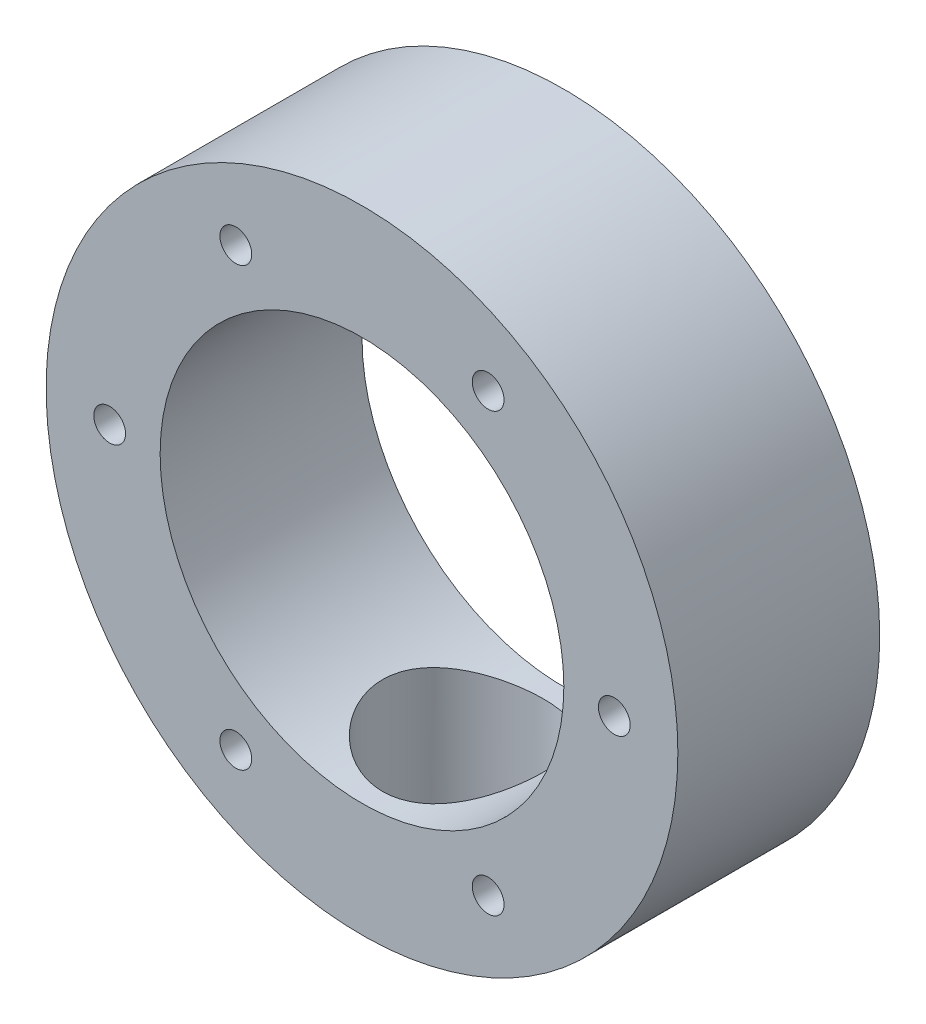
ISO-10303-21;
HEADER;
FILE_DESCRIPTION(('STEP AP214'),'2;1');
FILE_NAME('part.step','',(''),(''),'','','');
FILE_SCHEMA(('AUTOMOTIVE_DESIGN { 1 0 10303 214 1 1 1 1 }'));
ENDSEC;
DATA;
#1=APPLICATION_CONTEXT('core data for automotive mechanical design processes');
#2=APPLICATION_PROTOCOL_DEFINITION('international standard','automotive_design',2000,#1);
#3=PRODUCT_CONTEXT('',#1,'mechanical');
#4=PRODUCT('Part','Part','',(#3));
#5=PRODUCT_RELATED_PRODUCT_CATEGORY('part','',(#4));
#6=PRODUCT_DEFINITION_FORMATION('','',#4);
#7=PRODUCT_DEFINITION_CONTEXT('part definition',#1,'design');
#8=PRODUCT_DEFINITION('design','',#6,#7);
#9=PRODUCT_DEFINITION_SHAPE('','',#8);
#10=(LENGTH_UNIT() NAMED_UNIT(*) SI_UNIT(.MILLI.,.METRE.));
#11=(NAMED_UNIT(*) PLANE_ANGLE_UNIT() SI_UNIT($,.RADIAN.));
#12=(NAMED_UNIT(*) SI_UNIT($,.STERADIAN.) SOLID_ANGLE_UNIT());
#13=UNCERTAINTY_MEASURE_WITH_UNIT(LENGTH_MEASURE(1.E-05),#10,'distance_accuracy_value','');
#14=(GEOMETRIC_REPRESENTATION_CONTEXT(3) GLOBAL_UNCERTAINTY_ASSIGNED_CONTEXT((#13)) GLOBAL_UNIT_ASSIGNED_CONTEXT((#10,
#11,#12)) REPRESENTATION_CONTEXT('',''));
#15=CARTESIAN_POINT('',(0.,0.,0.));
#16=DIRECTION('',(0.,0.,1.));
#17=DIRECTION('',(1.,0.,0.));
#18=AXIS2_PLACEMENT_3D('',#15,#16,#17);
#19=CARTESIAN_POINT('',(0.,0.,6.35));
#20=DIRECTION('',(0.,0.,1.));
#21=DIRECTION('',(1.,0.,0.));
#22=AXIS2_PLACEMENT_3D('',#19,#20,#21);
#23=PLANE('',#22);
#24=CARTESIAN_POINT('',(3.96874999999994,-6.87407664253902,6.35));
#25=DIRECTION('',(0.,0.,1.));
#26=DIRECTION('',(1.,0.,0.));
#27=AXIS2_PLACEMENT_3D('',#24,#25,#26);
#28=CIRCLE('',#27,0.5);
#29=CARTESIAN_POINT('',(4.46874999999994,-6.87407664253902,6.35));
#30=VERTEX_POINT('',#29);
#31=EDGE_CURVE('E80',#30,#30,#28,.T.);
#32=ORIENTED_EDGE('',*,*,#31,.F.);
#33=EDGE_LOOP('',(#32));
#34=FACE_BOUND('',#33,.T.);
#35=CARTESIAN_POINT('',(3.96875000000003,6.87407664253897,6.35));
#36=DIRECTION('',(0.,0.,1.));
#37=DIRECTION('',(1.,0.,0.));
#38=AXIS2_PLACEMENT_3D('',#35,#36,#37);
#39=CIRCLE('',#38,0.500000000000001);
#40=CARTESIAN_POINT('',(4.46875000000004,6.87407664253897,6.35));
#41=VERTEX_POINT('',#40);
#42=EDGE_CURVE('E68',#41,#41,#39,.T.);
#43=ORIENTED_EDGE('',*,*,#42,.F.);
#44=EDGE_LOOP('',(#43));
#45=FACE_BOUND('',#44,.T.);
#46=CARTESIAN_POINT('',(-7.9375,0.,6.35));
#47=DIRECTION('',(0.,0.,1.));
#48=DIRECTION('',(1.,0.,0.));
#49=AXIS2_PLACEMENT_3D('',#46,#47,#48);
#50=CIRCLE('',#49,0.500000000000001);
#51=CARTESIAN_POINT('',(-7.4375,0.,6.35));
#52=VERTEX_POINT('',#51);
#53=EDGE_CURVE('E56',#52,#52,#50,.T.);
#54=ORIENTED_EDGE('',*,*,#53,.F.);
#55=EDGE_LOOP('',(#54));
#56=FACE_BOUND('',#55,.T.);
#57=CARTESIAN_POINT('',(0.,0.,6.35));
#58=DIRECTION('',(0.,0.,1.));
#59=DIRECTION('',(1.,0.,0.));
#60=AXIS2_PLACEMENT_3D('',#57,#58,#59);
#61=CIRCLE('',#60,9.9375);
#62=CARTESIAN_POINT('',(9.9375,0.,6.35));
#63=VERTEX_POINT('',#62);
#64=EDGE_CURVE('E42',#63,#63,#61,.T.);
#65=ORIENTED_EDGE('',*,*,#64,.T.);
#66=EDGE_LOOP('',(#65));
#67=FACE_BOUND('',#66,.T.);
#68=CARTESIAN_POINT('',(0.,0.,6.35));
#69=DIRECTION('',(0.,0.,1.));
#70=DIRECTION('',(1.,0.,0.));
#71=AXIS2_PLACEMENT_3D('',#68,#69,#70);
#72=CIRCLE('',#71,6.35);
#73=CARTESIAN_POINT('',(6.35,0.,6.35));
#74=VERTEX_POINT('',#73);
#75=EDGE_CURVE('E51',#74,#74,#72,.T.);
#76=ORIENTED_EDGE('',*,*,#75,.F.);
#77=EDGE_LOOP('',(#76));
#78=FACE_BOUND('',#77,.T.);
#79=CARTESIAN_POINT('',(-3.96874999999999,6.87407664253899,6.35));
#80=DIRECTION('',(0.,0.,1.));
#81=DIRECTION('',(1.,0.,0.));
#82=AXIS2_PLACEMENT_3D('',#79,#80,#81);
#83=CIRCLE('',#82,0.500000000000001);
#84=CARTESIAN_POINT('',(-3.46874999999999,6.87407664253899,6.35));
#85=VERTEX_POINT('',#84);
#86=EDGE_CURVE('E62',#85,#85,#83,.T.);
#87=ORIENTED_EDGE('',*,*,#86,.F.);
#88=EDGE_LOOP('',(#87));
#89=FACE_BOUND('',#88,.T.);
#90=CARTESIAN_POINT('',(7.9375,0.,6.35));
#91=DIRECTION('',(0.,0.,1.));
#92=DIRECTION('',(1.,0.,0.));
#93=AXIS2_PLACEMENT_3D('',#90,#91,#92);
#94=CIRCLE('',#93,0.500000000000001);
#95=CARTESIAN_POINT('',(8.4375,0.,6.35));
#96=VERTEX_POINT('',#95);
#97=EDGE_CURVE('E74',#96,#96,#94,.T.);
#98=ORIENTED_EDGE('',*,*,#97,.F.);
#99=EDGE_LOOP('',(#98));
#100=FACE_BOUND('',#99,.T.);
#101=CARTESIAN_POINT('',(-3.96875000000008,-6.87407664253894,6.35));
#102=DIRECTION('',(0.,0.,1.));
#103=DIRECTION('',(1.,0.,0.));
#104=AXIS2_PLACEMENT_3D('',#101,#102,#103);
#105=CIRCLE('',#104,0.500000000000001);
#106=CARTESIAN_POINT('',(-3.46875000000008,-6.87407664253894,6.35));
#107=VERTEX_POINT('',#106);
#108=EDGE_CURVE('E86',#107,#107,#105,.T.);
#109=ORIENTED_EDGE('',*,*,#108,.F.);
#110=EDGE_LOOP('',(#109));
#111=FACE_BOUND('',#110,.T.);
#112=ADVANCED_FACE('F31',(#34,#45,#56,#67,#78,#89,#100,#111),#23,.T.);
#113=CARTESIAN_POINT('',(0.,0.,0.));
#114=DIRECTION('',(0.,0.,1.));
#115=DIRECTION('',(1.,0.,0.));
#116=AXIS2_PLACEMENT_3D('',#113,#114,#115);
#117=PLANE('',#116);
#118=CARTESIAN_POINT('',(3.96874999999994,-6.87407664253902,0.));
#119=DIRECTION('',(0.,0.,1.));
#120=DIRECTION('',(1.,0.,0.));
#121=AXIS2_PLACEMENT_3D('',#118,#119,#120);
#122=CIRCLE('',#121,0.5);
#123=CARTESIAN_POINT('',(4.46874999999994,-6.87407664253902,0.));
#124=VERTEX_POINT('',#123);
#125=EDGE_CURVE('E83',#124,#124,#122,.T.);
#126=ORIENTED_EDGE('',*,*,#125,.T.);
#127=EDGE_LOOP('',(#126));
#128=FACE_BOUND('',#127,.T.);
#129=CARTESIAN_POINT('',(3.96875000000003,6.87407664253897,0.));
#130=DIRECTION('',(0.,0.,1.));
#131=DIRECTION('',(1.,0.,0.));
#132=AXIS2_PLACEMENT_3D('',#129,#130,#131);
#133=CIRCLE('',#132,0.500000000000001);
#134=CARTESIAN_POINT('',(4.46875000000004,6.87407664253897,0.));
#135=VERTEX_POINT('',#134);
#136=EDGE_CURVE('E71',#135,#135,#133,.T.);
#137=ORIENTED_EDGE('',*,*,#136,.T.);
#138=EDGE_LOOP('',(#137));
#139=FACE_BOUND('',#138,.T.);
#140=CARTESIAN_POINT('',(-7.9375,0.,0.));
#141=DIRECTION('',(0.,0.,1.));
#142=DIRECTION('',(1.,0.,0.));
#143=AXIS2_PLACEMENT_3D('',#140,#141,#142);
#144=CIRCLE('',#143,0.500000000000001);
#145=CARTESIAN_POINT('',(-7.4375,0.,0.));
#146=VERTEX_POINT('',#145);
#147=EDGE_CURVE('E59',#146,#146,#144,.T.);
#148=ORIENTED_EDGE('',*,*,#147,.T.);
#149=EDGE_LOOP('',(#148));
#150=FACE_BOUND('',#149,.T.);
#151=CARTESIAN_POINT('',(0.,0.,0.));
#152=DIRECTION('',(0.,0.,1.));
#153=DIRECTION('',(1.,0.,0.));
#154=AXIS2_PLACEMENT_3D('',#151,#152,#153);
#155=CIRCLE('',#154,9.9375);
#156=CARTESIAN_POINT('',(9.9375,0.,0.));
#157=VERTEX_POINT('',#156);
#158=EDGE_CURVE('E46',#157,#157,#155,.T.);
#159=ORIENTED_EDGE('',*,*,#158,.F.);
#160=EDGE_LOOP('',(#159));
#161=FACE_BOUND('',#160,.T.);
#162=CARTESIAN_POINT('',(0.,0.,0.));
#163=DIRECTION('',(0.,0.,1.));
#164=DIRECTION('',(1.,0.,0.));
#165=AXIS2_PLACEMENT_3D('',#162,#163,#164);
#166=CIRCLE('',#165,6.35);
#167=CARTESIAN_POINT('',(6.35,0.,0.));
#168=VERTEX_POINT('',#167);
#169=EDGE_CURVE('E53',#168,#168,#166,.T.);
#170=ORIENTED_EDGE('',*,*,#169,.T.);
#171=EDGE_LOOP('',(#170));
#172=FACE_BOUND('',#171,.T.);
#173=CARTESIAN_POINT('',(-3.96874999999999,6.87407664253899,0.));
#174=DIRECTION('',(0.,0.,1.));
#175=DIRECTION('',(1.,0.,0.));
#176=AXIS2_PLACEMENT_3D('',#173,#174,#175);
#177=CIRCLE('',#176,0.500000000000001);
#178=CARTESIAN_POINT('',(-3.46874999999999,6.87407664253899,0.));
#179=VERTEX_POINT('',#178);
#180=EDGE_CURVE('E65',#179,#179,#177,.T.);
#181=ORIENTED_EDGE('',*,*,#180,.T.);
#182=EDGE_LOOP('',(#181));
#183=FACE_BOUND('',#182,.T.);
#184=CARTESIAN_POINT('',(7.9375,0.,0.));
#185=DIRECTION('',(0.,0.,1.));
#186=DIRECTION('',(1.,0.,0.));
#187=AXIS2_PLACEMENT_3D('',#184,#185,#186);
#188=CIRCLE('',#187,0.500000000000001);
#189=CARTESIAN_POINT('',(8.4375,0.,0.));
#190=VERTEX_POINT('',#189);
#191=EDGE_CURVE('E77',#190,#190,#188,.T.);
#192=ORIENTED_EDGE('',*,*,#191,.T.);
#193=EDGE_LOOP('',(#192));
#194=FACE_BOUND('',#193,.T.);
#195=CARTESIAN_POINT('',(-3.96875000000008,-6.87407664253894,0.));
#196=DIRECTION('',(0.,0.,1.));
#197=DIRECTION('',(1.,0.,0.));
#198=AXIS2_PLACEMENT_3D('',#195,#196,#197);
#199=CIRCLE('',#198,0.500000000000001);
#200=CARTESIAN_POINT('',(-3.46875000000008,-6.87407664253894,0.));
#201=VERTEX_POINT('',#200);
#202=EDGE_CURVE('E89',#201,#201,#199,.T.);
#203=ORIENTED_EDGE('',*,*,#202,.T.);
#204=EDGE_LOOP('',(#203));
#205=FACE_BOUND('',#204,.T.);
#206=ADVANCED_FACE('F137',(#128,#139,#150,#161,#172,#183,#194,#205),#117,.F.);
#207=CARTESIAN_POINT('',(0.,0.,6.35));
#208=DIRECTION('',(0.,0.,-1.));
#209=DIRECTION('',(-1.,0.,0.));
#210=AXIS2_PLACEMENT_3D('',#207,#208,#209);
#211=CYLINDRICAL_SURFACE('',#210,9.9375);
#212=CARTESIAN_POINT('',(0.,-9.9375,0.647700000000002));
#213=CARTESIAN_POINT('',(-0.139556053405079,-9.93749769600198,0.647703771148036));
#214=CARTESIAN_POINT('',(-0.279153777595829,-9.93453104426548,0.659298161836035));
#215=CARTESIAN_POINT('',(-0.55434313250879,-9.92298410593462,0.705296731122764));
#216=CARTESIAN_POINT('',(-0.689932537682376,-9.91440075976008,0.739713341798802));
#217=CARTESIAN_POINT('',(-0.953091975487984,-9.89257012044472,0.83017665550556));
#218=CARTESIAN_POINT('',(-1.08067159825626,-9.87932853516018,0.886196895119666));
#219=CARTESIAN_POINT('',(-1.32462297022286,-9.84958889691357,1.01818287824129));
#220=CARTESIAN_POINT('',(-1.44099424608338,-9.83309070651201,1.09414946359518));
#221=CARTESIAN_POINT('',(-1.66169914730052,-9.7982343573015,1.26557713606802));
#222=CARTESIAN_POINT('',(-1.76576058990921,-9.77984670596307,1.36138266373195));
#223=CARTESIAN_POINT('',(-1.95652551628507,-9.74347809165346,1.56903149813308));
#224=CARTESIAN_POINT('',(-2.04322697287238,-9.72549717639534,1.68087667525621));
#225=CARTESIAN_POINT('',(-2.19810276870784,-9.69167947598302,1.91955831233387));
#226=CARTESIAN_POINT('',(-2.26597044492766,-9.67588007449177,2.04659953929622));
#227=CARTESIAN_POINT('',(-2.37927927609972,-9.64864527685565,2.31075493471741));
#228=CARTESIAN_POINT('',(-2.42472415429458,-9.63720915627179,2.44786742652417));
#229=CARTESIAN_POINT('',(-2.49096458934665,-9.62029922883659,2.72527478584326));
#230=CARTESIAN_POINT('',(-2.5122505865218,-9.61470698141808,2.8654451544209));
#231=CARTESIAN_POINT('',(-2.53109702988809,-9.60976361772754,3.14747031259233));
#232=CARTESIAN_POINT('',(-2.52866147958537,-9.61041144831191,3.28932481391743));
#233=CARTESIAN_POINT('',(-2.50052477205014,-9.61776869141806,3.56691531926991));
#234=CARTESIAN_POINT('',(-2.4754102969208,-9.62432524237752,3.70271547683842));
#235=CARTESIAN_POINT('',(-2.4035654865923,-9.6425172685715,3.96810868425311));
#236=CARTESIAN_POINT('',(-2.35683356373631,-9.65415311684286,4.09770127742365));
#237=CARTESIAN_POINT('',(-2.24258602569987,-9.68133147566003,4.34856270866521));
#238=CARTESIAN_POINT('',(-2.17485933286276,-9.69691335359014,4.4697309730815));
#239=CARTESIAN_POINT('',(-2.02069229302991,-9.73020613321525,4.69919217540447));
#240=CARTESIAN_POINT('',(-1.93424856673079,-9.74791741911124,4.80748278281259));
#241=CARTESIAN_POINT('',(-1.74207226023853,-9.78411516928911,5.01147423061153));
#242=CARTESIAN_POINT('',(-1.63584519843488,-9.80260907495806,5.10670851207337));
#243=CARTESIAN_POINT('',(-1.40870538393845,-9.83781700884755,5.27810163356944));
#244=CARTESIAN_POINT('',(-1.28779215152916,-9.85453097889388,5.35425985024448));
#245=CARTESIAN_POINT('',(-1.03403221039178,-9.88438380114255,5.48551887750673));
#246=CARTESIAN_POINT('',(-0.901143505662362,-9.89750936487115,5.54054171677394));
#247=CARTESIAN_POINT('',(-0.627593850871005,-9.91861001075401,5.62733574727157));
#248=CARTESIAN_POINT('',(-0.486934446868745,-9.92658611346819,5.65911154594631));
#249=CARTESIAN_POINT('',(-0.205823341034537,-9.93633727966082,5.69779189917353));
#250=CARTESIAN_POINT('',(-0.0654643884619986,-9.93827065048098,5.7053315458635));
#251=CARTESIAN_POINT('',(0.214510413137534,-9.93617048086652,5.69707050100478));
#252=CARTESIAN_POINT('',(0.354126330326764,-9.93213749756472,5.68127198875264));
#253=CARTESIAN_POINT('',(0.626429803530197,-9.91865942843353,5.62730596074036));
#254=CARTESIAN_POINT('',(0.759190969100928,-9.90929869624874,5.58948688414094));
#255=CARTESIAN_POINT('',(1.01647634558523,-9.88622177161489,5.49295294629532));
#256=CARTESIAN_POINT('',(1.14099970666764,-9.87250513064412,5.43423593314314));
#257=CARTESIAN_POINT('',(1.3807865899656,-9.84186080343859,5.29635550170162));
#258=CARTESIAN_POINT('',(1.49583999613298,-9.82487915288253,5.21683895724093));
#259=CARTESIAN_POINT('',(1.71119507994737,-9.78967032018159,5.04006610727776));
#260=CARTESIAN_POINT('',(1.81149411248579,-9.77144291555839,4.94280662787289));
#261=CARTESIAN_POINT('',(1.99712561406245,-9.73522382550345,4.73035591550872));
#262=CARTESIAN_POINT('',(2.08201188410304,-9.71724996454226,4.61477109735536));
#263=CARTESIAN_POINT('',(2.23118540556649,-9.68408901372488,4.37062456567735));
#264=CARTESIAN_POINT('',(2.29547356247125,-9.66890180138168,4.2420634229117));
#265=CARTESIAN_POINT('',(2.40114462600812,-9.64320327445182,3.97629402397275));
#266=CARTESIAN_POINT('',(2.44266294745312,-9.63266439078201,3.83914241575637));
#267=CARTESIAN_POINT('',(2.50196447261635,-9.61743391204497,3.55949519622106));
#268=CARTESIAN_POINT('',(2.51975308447373,-9.61274098466636,3.41700081016604));
#269=CARTESIAN_POINT('',(2.53080029489285,-9.60983781966126,3.13526028880717));
#270=CARTESIAN_POINT('',(2.52477303010935,-9.61143884573801,2.99604365961792));
#271=CARTESIAN_POINT('',(2.48999960773946,-9.62050542573587,2.72068187323168));
#272=CARTESIAN_POINT('',(2.4612539379392,-9.62797085374258,2.58453665015318));
#273=CARTESIAN_POINT('',(2.38225595220952,-9.64781803397517,2.31998979127892));
#274=CARTESIAN_POINT('',(2.33214199041156,-9.66016812267134,2.1915443008899));
#275=CARTESIAN_POINT('',(2.21193878730668,-9.68839655016138,1.94479107963602));
#276=CARTESIAN_POINT('',(2.14184668077045,-9.70427539497102,1.82648480608711));
#277=CARTESIAN_POINT('',(1.98145692476559,-9.73830663836046,1.59992799376736));
#278=CARTESIAN_POINT('',(1.89066581615039,-9.75650876151108,1.4920342109975));
#279=CARTESIAN_POINT('',(1.69241105187597,-9.7928437891191,1.29278117674104));
#280=CARTESIAN_POINT('',(1.58494342085758,-9.81097667601314,1.20142587898781));
#281=CARTESIAN_POINT('',(1.35393184888302,-9.84553983376073,1.0361538663315));
#282=CARTESIAN_POINT('',(1.23012218109736,-9.861931393621,0.962599848693917));
#283=CARTESIAN_POINT('',(0.971487354372456,-9.8907529946499,0.837466454148011));
#284=CARTESIAN_POINT('',(0.836669960894002,-9.90318579872014,0.785871742858682));
#285=CARTESIAN_POINT('',(0.585130585367522,-9.92090891347578,0.71354651754425));
#286=CARTESIAN_POINT('',(0.469579154288179,-9.92708718368781,0.68890843574759));
#287=CARTESIAN_POINT('',(0.236028285341764,-9.93538353729363,0.655984242571697));
#288=CARTESIAN_POINT('',(0.118029045960046,-9.9375019485983,0.64769681056469));
#289=CARTESIAN_POINT('',(0.,-9.9375,0.647700000000002));
#290=B_SPLINE_CURVE_WITH_KNOTS('',3,(#212,#213,#214,#215,#216,#217,#218,#219,#220,#221,#222,
#223,#224,#225,#226,#227,#228,#229,#230,#231,#232,#233,#234,#235,#236,#237,#238,#239,#240,#241,
#242,#243,#244,#245,#246,#247,#248,#249,#250,#251,#252,#253,#254,#255,#256,#257,#258,#259,#260,
#261,#262,#263,#264,#265,#266,#267,#268,#269,#270,#271,#272,#273,#274,#275,#276,#277,#278,#279,
#280,#281,#282,#283,#284,#285,#286,#287,#288,#289),.UNSPECIFIED.,.T.,.F.,(4,2,2,2,2,2,2,2,2,2,2,
2,2,2,2,2,2,2,2,2,2,2,2,2,2,2,2,2,2,2,2,2,2,2,2,2,2,2,4),(0.,0.418235549333107,
0.836699113849954,1.25465170035663,1.67262192961583,2.09857057744952,2.52456893566769,
2.95714340797709,3.38964602831797,3.81320207417785,4.23668663735535,4.64952035466162,
5.06238439665581,5.47954184501896,5.89677467278459,6.32633610847186,6.75591157934678,
7.18705693195709,7.61811681060138,8.03778485510959,8.45741371386578,8.87057643755022,
9.28378171781376,9.70451751376344,10.1253286459587,10.5568564656929,10.9883653130938,
11.4172793036744,11.8460955255459,12.262152404137,12.6782003498271,13.0915944487869,
13.5050478658373,13.9296395196232,14.3543325437424,14.7870619214364,15.219488622543,
15.5732384545132,15.9269597132469),.UNSPECIFIED.);
#291=CARTESIAN_POINT('',(0.,-9.9375,0.647700000000002));
#292=VERTEX_POINT('',#291);
#293=EDGE_CURVE('E10',#292,#292,#290,.T.);
#294=ORIENTED_EDGE('',*,*,#293,.T.);
#295=EDGE_LOOP('',(#294));
#296=FACE_BOUND('',#295,.T.);
#297=ORIENTED_EDGE('',*,*,#64,.F.);
#298=EDGE_LOOP('',(#297));
#299=FACE_BOUND('',#298,.T.);
#300=ORIENTED_EDGE('',*,*,#158,.T.);
#301=EDGE_LOOP('',(#300));
#302=FACE_BOUND('',#301,.T.);
#303=ADVANCED_FACE('F33',(#296,#299,#302),#211,.T.);
#304=CARTESIAN_POINT('',(0.,0.,6.35));
#305=DIRECTION('',(0.,0.,-1.));
#306=DIRECTION('',(-1.,0.,0.));
#307=AXIS2_PLACEMENT_3D('',#304,#305,#306);
#308=CYLINDRICAL_SURFACE('',#307,6.35);
#309=CARTESIAN_POINT('',(0.,-6.35,0.647700000000002));
#310=CARTESIAN_POINT('',(-0.135895095575363,-6.34999344928819,0.647708846632159));
#311=CARTESIAN_POINT('',(-0.272014949718178,-6.3455875728316,0.658724038831349));
#312=CARTESIAN_POINT('',(-0.54042737363337,-6.32839909095676,0.702396425438542));
#313=CARTESIAN_POINT('',(-0.672708459361932,-6.31559361140488,0.735112719895103));
#314=CARTESIAN_POINT('',(-0.929120124849737,-6.28298350582966,0.820815253355819));
#315=CARTESIAN_POINT('',(-1.05327574524848,-6.26320171247655,0.87373541353819));
#316=CARTESIAN_POINT('',(-1.29083517107231,-6.2185907868826,0.998081342990934));
#317=CARTESIAN_POINT('',(-1.40424274602626,-6.19376343388583,1.06950059125454));
#318=CARTESIAN_POINT('',(-1.6225478910059,-6.14027730058727,1.23234529630995));
#319=CARTESIAN_POINT('',(-1.72687742035825,-6.11150038485499,1.32449318423862));
#320=CARTESIAN_POINT('',(-1.91908151579658,-6.05390069588419,1.52465483272866));
#321=CARTESIAN_POINT('',(-2.0069481014253,-6.0250779072007,1.63267624298661));
#322=CARTESIAN_POINT('',(-2.16753476663613,-5.96924189122289,1.8672868398416));
#323=CARTESIAN_POINT('',(-2.23941916184942,-5.94236391999891,1.99448353371113));
#324=CARTESIAN_POINT('',(-2.36051973754433,-5.89531161631322,2.26039276958263));
#325=CARTESIAN_POINT('',(-2.40974657700556,-5.87513413293297,2.39909986033074));
#326=CARTESIAN_POINT('',(-2.48184322321096,-5.84503441938308,2.67756800845676));
#327=CARTESIAN_POINT('',(-2.50579965325002,-5.83469146939869,2.81700060655598));
#328=CARTESIAN_POINT('',(-2.53007003568973,-5.8242114145883,3.0982607861768));
#329=CARTESIAN_POINT('',(-2.53039545511286,-5.82406935974612,3.24008717268465));
#330=CARTESIAN_POINT('',(-2.50821868571532,-5.83364792170155,3.51170874378807));
#331=CARTESIAN_POINT('',(-2.48728499266679,-5.84269087655421,3.64166051365505));
#332=CARTESIAN_POINT('',(-2.42579768269568,-5.86848407165412,3.89602622425995));
#333=CARTESIAN_POINT('',(-2.38524067993949,-5.88523564193235,4.0204392052806));
#334=CARTESIAN_POINT('',(-2.28488875878976,-5.92492487572003,4.26317903049335));
#335=CARTESIAN_POINT('',(-2.22472007811308,-5.94798119678154,4.38133109111957));
#336=CARTESIAN_POINT('',(-2.08711501498513,-5.99764888800169,4.60629270694667));
#337=CARTESIAN_POINT('',(-2.00967218801685,-6.02426158345811,4.71309800696674));
#338=CARTESIAN_POINT('',(-1.83275590515023,-6.08052220381734,4.92092812913053));
#339=CARTESIAN_POINT('',(-1.73205069134421,-6.11024661728899,5.02088649783303));
#340=CARTESIAN_POINT('',(-1.51498780315104,-6.16764982352103,5.20283550770597));
#341=CARTESIAN_POINT('',(-1.39862708019575,-6.19532821623303,5.28482264117531));
#342=CARTESIAN_POINT('',(-1.15055639955816,-6.2462017768141,5.42988260071449));
#343=CARTESIAN_POINT('',(-1.01859263895552,-6.2692996447215,5.49255799691528));
#344=CARTESIAN_POINT('',(-0.744842522405649,-6.30767520940892,5.5944534679058));
#345=CARTESIAN_POINT('',(-0.603061144788146,-6.32295683716184,5.63368533467771));
#346=CARTESIAN_POINT('',(-0.322642563022664,-6.3432637460665,5.68543204829192));
#347=CARTESIAN_POINT('',(-0.184309519190646,-6.34883853721909,5.69938031221839));
#348=CARTESIAN_POINT('',(0.0928193417894908,-6.35083191347756,5.70439161709373));
#349=CARTESIAN_POINT('',(0.231615031369769,-6.34725284275709,5.69546051712083));
#350=CARTESIAN_POINT('',(0.499256988182406,-6.331700604547,5.65602362115969));
#351=CARTESIAN_POINT('',(0.62827142477857,-6.32010707578518,5.62649305332527));
#352=CARTESIAN_POINT('',(0.87939741594319,-6.29008462266228,5.54801892496921));
#353=CARTESIAN_POINT('',(1.00150808007104,-6.27165481887362,5.49907286675667));
#354=CARTESIAN_POINT('',(1.23955095948023,-6.22905189187513,5.38156194052759));
#355=CARTESIAN_POINT('',(1.35518098202847,-6.20472068867507,5.31244403976831));
#356=CARTESIAN_POINT('',(1.57360636827681,-6.15295727578712,5.15716587238911));
#357=CARTESIAN_POINT('',(1.6763965909997,-6.12552383230409,5.07099881484527));
#358=CARTESIAN_POINT('',(1.87327223967056,-6.06832273189539,4.87746031543495));
#359=CARTESIAN_POINT('',(1.96634934037784,-6.03851971962499,4.76907093470253));
#360=CARTESIAN_POINT('',(2.13323730306176,-5.98160462933261,4.53767905696105));
#361=CARTESIAN_POINT('',(2.20704512078537,-5.95449297692329,4.41467425539952));
#362=CARTESIAN_POINT('',(2.33373090662017,-5.90600253902098,4.1557616747282));
#363=CARTESIAN_POINT('',(2.38641032900777,-5.88467871906066,4.01974572157379));
#364=CARTESIAN_POINT('',(2.46771450632583,-5.85105611210903,3.73967021834022));
#365=CARTESIAN_POINT('',(2.49635677411131,-5.83875075532614,3.5956166060458));
#366=CARTESIAN_POINT('',(2.52710941809545,-5.82550189193329,3.31463023397183));
#367=CARTESIAN_POINT('',(2.53096703144596,-5.8238103619624,3.17792275236991));
#368=CARTESIAN_POINT('',(2.51661994352938,-5.83002444594917,2.90590645343382));
#369=CARTESIAN_POINT('',(2.49841798152607,-5.8379288683227,2.77059746454482));
#370=CARTESIAN_POINT('',(2.44189016194609,-5.8617873258111,2.51058876905659));
#371=CARTESIAN_POINT('',(2.4043716441077,-5.87741748602149,2.38568112650177));
#372=CARTESIAN_POINT('',(2.31102740821016,-5.91474142468962,2.14388130426449));
#373=CARTESIAN_POINT('',(2.25519664549909,-5.93643687376794,2.02699134403167));
#374=CARTESIAN_POINT('',(2.12314068183601,-5.98497980335223,1.79730137917416));
#375=CARTESIAN_POINT('',(2.04593590880217,-6.01205017140779,1.68511239689961));
#376=CARTESIAN_POINT('',(1.8747657620603,-6.06760621465675,1.47473406823582));
#377=CARTESIAN_POINT('',(1.78079542891168,-6.09609230683346,1.37654887983254));
#378=CARTESIAN_POINT('',(1.57159773472696,-6.15345877453749,1.19052707652271));
#379=CARTESIAN_POINT('',(1.45539560838752,-6.18224798027435,1.10375299743602));
#380=CARTESIAN_POINT('',(1.20902415779901,-6.23511354774023,0.950918320980564));
#381=CARTESIAN_POINT('',(1.07884835418727,-6.25918770844038,0.884867388759695));
#382=CARTESIAN_POINT('',(0.810467300874366,-6.29949438827744,0.776905104562776));
#383=CARTESIAN_POINT('',(0.672459358145955,-6.31586600609259,0.734562697216571));
#384=CARTESIAN_POINT('',(0.461361980768655,-6.33361441723012,0.689122405064101));
#385=CARTESIAN_POINT('',(0.390380978558071,-6.33839446964168,0.676990674930914));
#386=CARTESIAN_POINT('',(0.247536093123044,-6.34557422500662,0.658825144748604));
#387=CARTESIAN_POINT('',(0.175672879895211,-6.34797563337106,0.652786975754108));
#388=CARTESIAN_POINT('',(0.0691545801110535,-6.34971840089543,0.648408350686297));
#389=CARTESIAN_POINT('',(0.0345845685811947,-6.35000166712081,0.647697748579851));
#390=CARTESIAN_POINT('',(0.,-6.35,0.647700000000002));
#391=B_SPLINE_CURVE_WITH_KNOTS('',3,(#309,#310,#311,#312,#313,#314,#315,#316,#317,#318,#319,
#320,#321,#322,#323,#324,#325,#326,#327,#328,#329,#330,#331,#332,#333,#334,#335,#336,#337,#338,
#339,#340,#341,#342,#343,#344,#345,#346,#347,#348,#349,#350,#351,#352,#353,#354,#355,#356,#357,
#358,#359,#360,#361,#362,#363,#364,#365,#366,#367,#368,#369,#370,#371,#372,#373,#374,#375,#376,
#377,#378,#379,#380,#381,#382,#383,#384,#385,#386,#387,#388,#389,#390),.UNSPECIFIED.,.T.,.F.,(4,
2,2,2,2,2,2,2,2,2,2,2,2,2,2,2,2,2,2,2,2,2,2,2,2,2,2,2,2,2,2,2,2,2,2,2,2,2,2,2,4),(0.,
0.407570227143629,0.816254999632602,1.22361442111736,1.63083044164303,2.05538729676068,
2.48014942750687,2.92358490757317,3.36681156489702,3.7900881474376,4.21315933230749,
4.60713256620772,5.00117380106071,5.40321285737543,5.8054021552072,6.23834430653801,
6.67137088623658,7.11279104016825,7.55398897458855,7.96928242713176,8.38446953958645,
8.78122781561114,9.17803714886213,9.58695372627196,9.99603351010808,10.4318556837173,
10.8677466689789,11.3076428447138,11.7472182444353,12.1554299513644,12.5635909735018,
12.9559318250266,13.3483808494001,13.7631570588593,14.1780561678173,14.6194736938952,
15.061096789393,15.4944056174341,15.7106711848639,15.9267815843799,16.0305060080805),.UNSPECIFIED.);
#392=CARTESIAN_POINT('',(0.,-6.35,0.647700000000002));
#393=VERTEX_POINT('',#392);
#394=EDGE_CURVE('E92',#393,#393,#391,.T.);
#395=ORIENTED_EDGE('',*,*,#394,.F.);
#396=EDGE_LOOP('',(#395));
#397=FACE_BOUND('',#396,.T.);
#398=ORIENTED_EDGE('',*,*,#75,.T.);
#399=EDGE_LOOP('',(#398));
#400=FACE_BOUND('',#399,.T.);
#401=ORIENTED_EDGE('',*,*,#169,.F.);
#402=EDGE_LOOP('',(#401));
#403=FACE_BOUND('',#402,.T.);
#404=ADVANCED_FACE('F99',(#397,#400,#403),#308,.F.);
#405=CARTESIAN_POINT('',(-7.9375,0.,6.35));
#406=DIRECTION('',(0.,0.,-1.));
#407=DIRECTION('',(-1.,0.,0.));
#408=AXIS2_PLACEMENT_3D('',#405,#406,#407);
#409=CYLINDRICAL_SURFACE('',#408,0.500000000000001);
#410=ORIENTED_EDGE('',*,*,#53,.T.);
#411=EDGE_LOOP('',(#410));
#412=FACE_BOUND('',#411,.T.);
#413=ORIENTED_EDGE('',*,*,#147,.F.);
#414=EDGE_LOOP('',(#413));
#415=FACE_BOUND('',#414,.T.);
#416=ADVANCED_FACE('F127',(#412,#415),#409,.F.);
#417=CARTESIAN_POINT('',(-3.96874999999999,6.87407664253899,6.35));
#418=DIRECTION('',(0.,0.,-1.));
#419=DIRECTION('',(-1.,0.,0.));
#420=AXIS2_PLACEMENT_3D('',#417,#418,#419);
#421=CYLINDRICAL_SURFACE('',#420,0.500000000000001);
#422=ORIENTED_EDGE('',*,*,#86,.T.);
#423=EDGE_LOOP('',(#422));
#424=FACE_BOUND('',#423,.T.);
#425=ORIENTED_EDGE('',*,*,#180,.F.);
#426=EDGE_LOOP('',(#425));
#427=FACE_BOUND('',#426,.T.);
#428=ADVANCED_FACE('F124',(#424,#427),#421,.F.);
#429=CARTESIAN_POINT('',(3.96875000000003,6.87407664253897,6.35));
#430=DIRECTION('',(0.,0.,-1.));
#431=DIRECTION('',(-1.,0.,0.));
#432=AXIS2_PLACEMENT_3D('',#429,#430,#431);
#433=CYLINDRICAL_SURFACE('',#432,0.500000000000001);
#434=ORIENTED_EDGE('',*,*,#42,.T.);
#435=EDGE_LOOP('',(#434));
#436=FACE_BOUND('',#435,.T.);
#437=ORIENTED_EDGE('',*,*,#136,.F.);
#438=EDGE_LOOP('',(#437));
#439=FACE_BOUND('',#438,.T.);
#440=ADVANCED_FACE('F120',(#436,#439),#433,.F.);
#441=CARTESIAN_POINT('',(7.9375,0.,6.35));
#442=DIRECTION('',(0.,0.,-1.));
#443=DIRECTION('',(-1.,0.,0.));
#444=AXIS2_PLACEMENT_3D('',#441,#442,#443);
#445=CYLINDRICAL_SURFACE('',#444,0.500000000000001);
#446=ORIENTED_EDGE('',*,*,#97,.T.);
#447=EDGE_LOOP('',(#446));
#448=FACE_BOUND('',#447,.T.);
#449=ORIENTED_EDGE('',*,*,#191,.F.);
#450=EDGE_LOOP('',(#449));
#451=FACE_BOUND('',#450,.T.);
#452=ADVANCED_FACE('F116',(#448,#451),#445,.F.);
#453=CARTESIAN_POINT('',(3.96874999999994,-6.87407664253902,6.35));
#454=DIRECTION('',(0.,0.,-1.));
#455=DIRECTION('',(-1.,0.,0.));
#456=AXIS2_PLACEMENT_3D('',#453,#454,#455);
#457=CYLINDRICAL_SURFACE('',#456,0.5);
#458=ORIENTED_EDGE('',*,*,#31,.T.);
#459=EDGE_LOOP('',(#458));
#460=FACE_BOUND('',#459,.T.);
#461=ORIENTED_EDGE('',*,*,#125,.F.);
#462=EDGE_LOOP('',(#461));
#463=FACE_BOUND('',#462,.T.);
#464=ADVANCED_FACE('F112',(#460,#463),#457,.F.);
#465=CARTESIAN_POINT('',(-3.96875000000008,-6.87407664253894,6.35));
#466=DIRECTION('',(0.,0.,-1.));
#467=DIRECTION('',(-1.,0.,0.));
#468=AXIS2_PLACEMENT_3D('',#465,#466,#467);
#469=CYLINDRICAL_SURFACE('',#468,0.500000000000001);
#470=ORIENTED_EDGE('',*,*,#108,.T.);
#471=EDGE_LOOP('',(#470));
#472=FACE_BOUND('',#471,.T.);
#473=ORIENTED_EDGE('',*,*,#202,.F.);
#474=EDGE_LOOP('',(#473));
#475=FACE_BOUND('',#474,.T.);
#476=ADVANCED_FACE('F107',(#472,#475),#469,.F.);
#477=CARTESIAN_POINT('',(0.,-9.9375,3.175));
#478=DIRECTION('',(0.,-1.,0.));
#479=DIRECTION('',(0.,0.,-1.));
#480=AXIS2_PLACEMENT_3D('',#477,#478,#479);
#481=CYLINDRICAL_SURFACE('',#480,2.5273);
#482=ORIENTED_EDGE('',*,*,#394,.T.);
#483=EDGE_LOOP('',(#482));
#484=FACE_BOUND('',#483,.T.);
#485=ORIENTED_EDGE('',*,*,#293,.F.);
#486=EDGE_LOOP('',(#485));
#487=FACE_BOUND('',#486,.T.);
#488=ADVANCED_FACE('F103',(#484,#487),#481,.F.);
#489=CLOSED_SHELL('',(#112,#206,#303,#404,#416,#428,#440,#452,#464,#476,#488));
#490=MANIFOLD_SOLID_BREP('B2',#489);
#491=ADVANCED_BREP_SHAPE_REPRESENTATION('',(#18,#490),#14);
#492=SHAPE_DEFINITION_REPRESENTATION(#9,#491);
ENDSEC;
END-ISO-10303-21;
